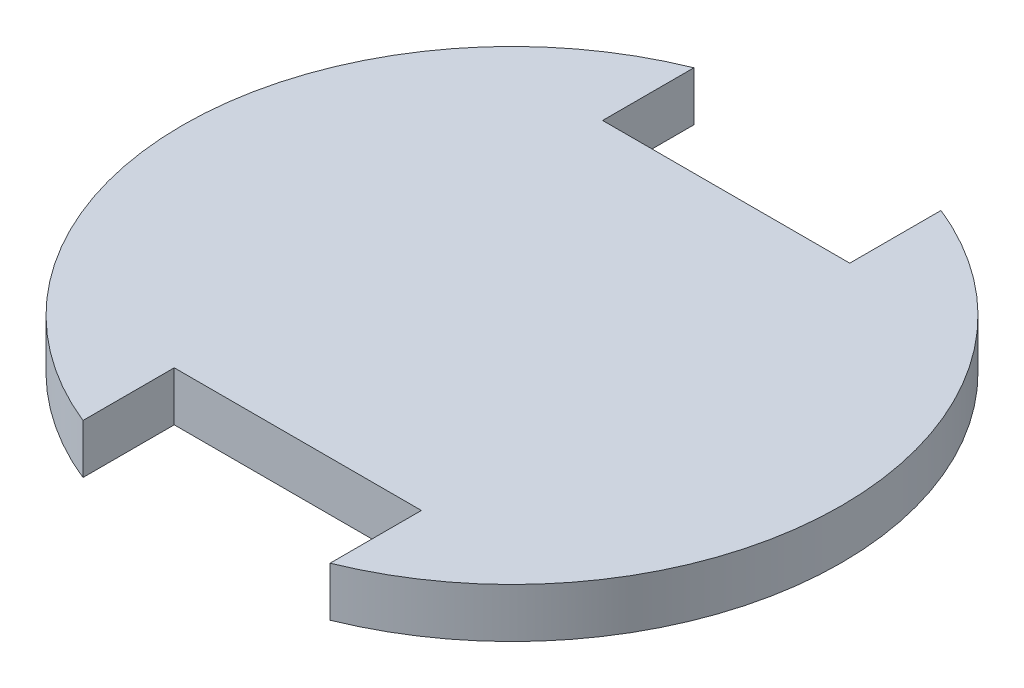
ISO-10303-21;
HEADER;
FILE_DESCRIPTION(('STEP AP214'),'2;1');
FILE_NAME('part.step','',(''),(''),'','','');
FILE_SCHEMA(('AUTOMOTIVE_DESIGN { 1 0 10303 214 1 1 1 1 }'));
ENDSEC;
DATA;
#1=APPLICATION_CONTEXT('core data for automotive mechanical design processes');
#2=APPLICATION_PROTOCOL_DEFINITION('international standard','automotive_design',2000,#1);
#3=PRODUCT_CONTEXT('',#1,'mechanical');
#4=PRODUCT('Part','Part','',(#3));
#5=PRODUCT_RELATED_PRODUCT_CATEGORY('part','',(#4));
#6=PRODUCT_DEFINITION_FORMATION('','',#4);
#7=PRODUCT_DEFINITION_CONTEXT('part definition',#1,'design');
#8=PRODUCT_DEFINITION('design','',#6,#7);
#9=PRODUCT_DEFINITION_SHAPE('','',#8);
#10=(LENGTH_UNIT() NAMED_UNIT(*) SI_UNIT(.MILLI.,.METRE.));
#11=(NAMED_UNIT(*) PLANE_ANGLE_UNIT() SI_UNIT($,.RADIAN.));
#12=(NAMED_UNIT(*) SI_UNIT($,.STERADIAN.) SOLID_ANGLE_UNIT());
#13=UNCERTAINTY_MEASURE_WITH_UNIT(LENGTH_MEASURE(1.E-05),#10,'distance_accuracy_value','');
#14=(GEOMETRIC_REPRESENTATION_CONTEXT(3) GLOBAL_UNCERTAINTY_ASSIGNED_CONTEXT((#13)) GLOBAL_UNIT_ASSIGNED_CONTEXT((#10,
#11,#12)) REPRESENTATION_CONTEXT('',''));
#15=CARTESIAN_POINT('',(0.,0.,0.));
#16=DIRECTION('',(0.,0.,1.));
#17=DIRECTION('',(1.,0.,0.));
#18=AXIS2_PLACEMENT_3D('',#15,#16,#17);
#19=CARTESIAN_POINT('',(0.,1.5,0.));
#20=DIRECTION('',(0.,-1.,0.));
#21=DIRECTION('',(0.,0.,-1.));
#22=AXIS2_PLACEMENT_3D('',#19,#20,#21);
#23=CYLINDRICAL_SURFACE('',#22,20.);
#24=DIRECTION('',(0.,-1.,0.));
#25=VECTOR('',#24,1.);
#26=CARTESIAN_POINT('',(7.5,1.5,18.5404962177392));
#27=LINE('',#26,#25);
#28=CARTESIAN_POINT('',(7.5,-1.5,18.5404962177392));
#29=VERTEX_POINT('',#28);
#30=CARTESIAN_POINT('',(7.5,1.5,18.5404962177392));
#31=VERTEX_POINT('',#30);
#32=EDGE_CURVE('E115',#29,#31,#27,.F.);
#33=ORIENTED_EDGE('',*,*,#32,.F.);
#34=CARTESIAN_POINT('',(0.,-1.5,0.));
#35=DIRECTION('',(0.,1.,0.));
#36=DIRECTION('',(0.,0.,1.));
#37=AXIS2_PLACEMENT_3D('',#34,#35,#36);
#38=CIRCLE('',#37,20.);
#39=CARTESIAN_POINT('',(7.5,-1.5,-18.5404962177392));
#40=VERTEX_POINT('',#39);
#41=EDGE_CURVE('E150',#29,#40,#38,.T.);
#42=ORIENTED_EDGE('',*,*,#41,.T.);
#43=DIRECTION('',(0.,-1.,0.));
#44=VECTOR('',#43,1.);
#45=CARTESIAN_POINT('',(7.5,1.5,-18.5404962177392));
#46=LINE('',#45,#44);
#47=CARTESIAN_POINT('',(7.5,1.5,-18.5404962177392));
#48=VERTEX_POINT('',#47);
#49=EDGE_CURVE('E144',#40,#48,#46,.F.);
#50=ORIENTED_EDGE('',*,*,#49,.T.);
#51=CARTESIAN_POINT('',(0.,1.5,0.));
#52=DIRECTION('',(0.,1.,0.));
#53=DIRECTION('',(0.,0.,1.));
#54=AXIS2_PLACEMENT_3D('',#51,#52,#53);
#55=CIRCLE('',#54,20.);
#56=EDGE_CURVE('E153',#31,#48,#55,.T.);
#57=ORIENTED_EDGE('',*,*,#56,.F.);
#58=EDGE_LOOP('',(#33,#42,#50,#57));
#59=FACE_BOUND('',#58,.T.);
#60=ADVANCED_FACE('F35',(#59),#23,.T.);
#61=DIRECTION('',(0.,-1.,0.));
#62=VECTOR('',#61,1.);
#63=CARTESIAN_POINT('',(-7.5,1.5,18.5404962177392));
#64=LINE('',#63,#62);
#65=CARTESIAN_POINT('',(-7.5,1.5,18.5404962177392));
#66=VERTEX_POINT('',#65);
#67=CARTESIAN_POINT('',(-7.5,-1.5,18.5404962177392));
#68=VERTEX_POINT('',#67);
#69=EDGE_CURVE('E49',#66,#68,#64,.T.);
#70=ORIENTED_EDGE('',*,*,#69,.F.);
#71=CARTESIAN_POINT('',(-7.5,1.5,-18.5404962177392));
#72=VERTEX_POINT('',#71);
#73=EDGE_CURVE('E151',#72,#66,#55,.T.);
#74=ORIENTED_EDGE('',*,*,#73,.F.);
#75=DIRECTION('',(0.,-1.,0.));
#76=VECTOR('',#75,1.);
#77=CARTESIAN_POINT('',(-7.5,1.5,-18.5404962177392));
#78=LINE('',#77,#76);
#79=CARTESIAN_POINT('',(-7.5,-1.5,-18.5404962177392));
#80=VERTEX_POINT('',#79);
#81=EDGE_CURVE('E147',#72,#80,#78,.T.);
#82=ORIENTED_EDGE('',*,*,#81,.T.);
#83=EDGE_CURVE('E154',#80,#68,#38,.T.);
#84=ORIENTED_EDGE('',*,*,#83,.T.);
#85=EDGE_LOOP('',(#70,#74,#82,#84));
#86=FACE_BOUND('',#85,.T.);
#87=ADVANCED_FACE('F176',(#86),#23,.T.);
#88=CARTESIAN_POINT('',(0.,1.5,0.));
#89=DIRECTION('',(0.,1.,0.));
#90=DIRECTION('',(0.,0.,1.));
#91=AXIS2_PLACEMENT_3D('',#88,#89,#90);
#92=PLANE('',#91);
#93=DIRECTION('',(1.,0.,0.));
#94=VECTOR('',#93,1.);
#95=CARTESIAN_POINT('',(-7.49999999999999,1.5,13.));
#96=LINE('',#95,#94);
#97=CARTESIAN_POINT('',(-7.49999999999999,1.5,13.));
#98=VERTEX_POINT('',#97);
#99=CARTESIAN_POINT('',(7.5,1.5,13.));
#100=VERTEX_POINT('',#99);
#101=EDGE_CURVE('E103',#98,#100,#96,.T.);
#102=ORIENTED_EDGE('',*,*,#101,.T.);
#103=DIRECTION('',(0.,0.,1.));
#104=VECTOR('',#103,1.);
#105=CARTESIAN_POINT('',(7.49999999999999,1.5,23.));
#106=LINE('',#105,#104);
#107=EDGE_CURVE('E112',#100,#31,#106,.T.);
#108=ORIENTED_EDGE('',*,*,#107,.T.);
#109=ORIENTED_EDGE('',*,*,#56,.T.);
#110=DIRECTION('',(0.,0.,-1.));
#111=VECTOR('',#110,1.);
#112=CARTESIAN_POINT('',(7.49999999999999,1.5,-23.));
#113=LINE('',#112,#111);
#114=CARTESIAN_POINT('',(7.5,1.5,-13.));
#115=VERTEX_POINT('',#114);
#116=EDGE_CURVE('E136',#115,#48,#113,.T.);
#117=ORIENTED_EDGE('',*,*,#116,.F.);
#118=DIRECTION('',(1.,0.,0.));
#119=VECTOR('',#118,1.);
#120=CARTESIAN_POINT('',(-7.49999999999999,1.5,-13.));
#121=LINE('',#120,#119);
#122=CARTESIAN_POINT('',(-7.49999999999999,1.5,-13.));
#123=VERTEX_POINT('',#122);
#124=EDGE_CURVE('E134',#123,#115,#121,.T.);
#125=ORIENTED_EDGE('',*,*,#124,.F.);
#126=DIRECTION('',(0.,0.,1.));
#127=VECTOR('',#126,1.);
#128=CARTESIAN_POINT('',(-7.50000000000001,1.5,-23.));
#129=LINE('',#128,#127);
#130=EDGE_CURVE('E129',#72,#123,#129,.T.);
#131=ORIENTED_EDGE('',*,*,#130,.F.);
#132=ORIENTED_EDGE('',*,*,#73,.T.);
#133=DIRECTION('',(0.,0.,-1.));
#134=VECTOR('',#133,1.);
#135=CARTESIAN_POINT('',(-7.50000000000001,1.5,23.));
#136=LINE('',#135,#134);
#137=EDGE_CURVE('E118',#66,#98,#136,.T.);
#138=ORIENTED_EDGE('',*,*,#137,.T.);
#139=EDGE_LOOP('',(#102,#108,#109,#117,#125,#131,#132,#138));
#140=FACE_BOUND('',#139,.T.);
#141=ADVANCED_FACE('F120',(#140),#92,.T.);
#142=CARTESIAN_POINT('',(0.,-1.5,0.));
#143=DIRECTION('',(0.,1.,0.));
#144=DIRECTION('',(0.,0.,1.));
#145=AXIS2_PLACEMENT_3D('',#142,#143,#144);
#146=PLANE('',#145);
#147=DIRECTION('',(0.,0.,1.));
#148=VECTOR('',#147,1.);
#149=CARTESIAN_POINT('',(7.5,-1.5,0.));
#150=LINE('',#149,#148);
#151=CARTESIAN_POINT('',(7.5,-1.5,13.));
#152=VERTEX_POINT('',#151);
#153=EDGE_CURVE('E11',#152,#29,#150,.T.);
#154=ORIENTED_EDGE('',*,*,#153,.F.);
#155=DIRECTION('',(-1.,0.,0.));
#156=VECTOR('',#155,1.);
#157=CARTESIAN_POINT('',(-7.49999999999999,-1.5,13.));
#158=LINE('',#157,#156);
#159=CARTESIAN_POINT('',(-7.49999999999999,-1.5,13.));
#160=VERTEX_POINT('',#159);
#161=EDGE_CURVE('E106',#152,#160,#158,.T.);
#162=ORIENTED_EDGE('',*,*,#161,.T.);
#163=DIRECTION('',(0.,0.,1.));
#164=VECTOR('',#163,1.);
#165=CARTESIAN_POINT('',(-7.50000000000001,-1.5,23.));
#166=LINE('',#165,#164);
#167=EDGE_CURVE('E127',#160,#68,#166,.T.);
#168=ORIENTED_EDGE('',*,*,#167,.T.);
#169=ORIENTED_EDGE('',*,*,#83,.F.);
#170=DIRECTION('',(0.,0.,-1.));
#171=VECTOR('',#170,1.);
#172=CARTESIAN_POINT('',(-7.50000000000001,-1.5,-23.));
#173=LINE('',#172,#171);
#174=CARTESIAN_POINT('',(-7.49999999999999,-1.5,-13.));
#175=VERTEX_POINT('',#174);
#176=EDGE_CURVE('E130',#175,#80,#173,.T.);
#177=ORIENTED_EDGE('',*,*,#176,.F.);
#178=DIRECTION('',(-1.,0.,0.));
#179=VECTOR('',#178,1.);
#180=CARTESIAN_POINT('',(-7.49999999999999,-1.5,-13.));
#181=LINE('',#180,#179);
#182=CARTESIAN_POINT('',(7.5,-1.5,-13.));
#183=VERTEX_POINT('',#182);
#184=EDGE_CURVE('E132',#183,#175,#181,.T.);
#185=ORIENTED_EDGE('',*,*,#184,.F.);
#186=DIRECTION('',(0.,0.,-1.));
#187=VECTOR('',#186,1.);
#188=CARTESIAN_POINT('',(7.5,-1.5,0.));
#189=LINE('',#188,#187);
#190=EDGE_CURVE('E42',#183,#40,#189,.T.);
#191=ORIENTED_EDGE('',*,*,#190,.T.);
#192=ORIENTED_EDGE('',*,*,#41,.F.);
#193=EDGE_LOOP('',(#154,#162,#168,#169,#177,#185,#191,#192));
#194=FACE_BOUND('',#193,.T.);
#195=ADVANCED_FACE('F160',(#194),#146,.F.);
#196=CARTESIAN_POINT('',(-7.50000000000001,-19.5277563773199,-23.));
#197=DIRECTION('',(-1.,0.,0.));
#198=DIRECTION('',(0.,0.,1.));
#199=AXIS2_PLACEMENT_3D('',#196,#197,#198);
#200=PLANE('',#199);
#201=ORIENTED_EDGE('',*,*,#130,.T.);
#202=DIRECTION('',(0.,1.,0.));
#203=VECTOR('',#202,1.);
#204=CARTESIAN_POINT('',(-7.49999999999999,-19.5277563773199,-13.));
#205=LINE('',#204,#203);
#206=EDGE_CURVE('E139',#175,#123,#205,.T.);
#207=ORIENTED_EDGE('',*,*,#206,.F.);
#208=ORIENTED_EDGE('',*,*,#176,.T.);
#209=ORIENTED_EDGE('',*,*,#81,.F.);
#210=EDGE_LOOP('',(#201,#207,#208,#209));
#211=FACE_BOUND('',#210,.T.);
#212=ADVANCED_FACE('F173',(#211),#200,.F.);
#213=CARTESIAN_POINT('',(7.49999999999999,-19.5277563773199,-23.));
#214=DIRECTION('',(1.,0.,0.));
#215=DIRECTION('',(0.,0.,-1.));
#216=AXIS2_PLACEMENT_3D('',#213,#214,#215);
#217=PLANE('',#216);
#218=ORIENTED_EDGE('',*,*,#190,.F.);
#219=DIRECTION('',(0.,1.,0.));
#220=VECTOR('',#219,1.);
#221=CARTESIAN_POINT('',(7.5,-19.5277563773199,-13.));
#222=LINE('',#221,#220);
#223=EDGE_CURVE('E57',#183,#115,#222,.T.);
#224=ORIENTED_EDGE('',*,*,#223,.T.);
#225=ORIENTED_EDGE('',*,*,#116,.T.);
#226=ORIENTED_EDGE('',*,*,#49,.F.);
#227=EDGE_LOOP('',(#218,#224,#225,#226));
#228=FACE_BOUND('',#227,.T.);
#229=ADVANCED_FACE('F164',(#228),#217,.F.);
#230=CARTESIAN_POINT('',(-7.49999999999999,-19.5277563773199,-13.));
#231=DIRECTION('',(0.,0.,1.));
#232=DIRECTION('',(1.,0.,0.));
#233=AXIS2_PLACEMENT_3D('',#230,#231,#232);
#234=PLANE('',#233);
#235=ORIENTED_EDGE('',*,*,#184,.T.);
#236=ORIENTED_EDGE('',*,*,#206,.T.);
#237=ORIENTED_EDGE('',*,*,#124,.T.);
#238=ORIENTED_EDGE('',*,*,#223,.F.);
#239=EDGE_LOOP('',(#235,#236,#237,#238));
#240=FACE_BOUND('',#239,.T.);
#241=ADVANCED_FACE('F170',(#240),#234,.F.);
#242=CARTESIAN_POINT('',(7.49999999999999,-19.5277563773199,23.));
#243=DIRECTION('',(-1.,0.,0.));
#244=DIRECTION('',(0.,0.,1.));
#245=AXIS2_PLACEMENT_3D('',#242,#243,#244);
#246=PLANE('',#245);
#247=ORIENTED_EDGE('',*,*,#32,.T.);
#248=ORIENTED_EDGE('',*,*,#107,.F.);
#249=DIRECTION('',(0.,1.,0.));
#250=VECTOR('',#249,1.);
#251=CARTESIAN_POINT('',(7.5,-19.5277563773199,13.));
#252=LINE('',#251,#250);
#253=EDGE_CURVE('E98',#152,#100,#252,.T.);
#254=ORIENTED_EDGE('',*,*,#253,.F.);
#255=ORIENTED_EDGE('',*,*,#153,.T.);
#256=EDGE_LOOP('',(#247,#248,#254,#255));
#257=FACE_BOUND('',#256,.T.);
#258=ADVANCED_FACE('F113',(#257),#246,.T.);
#259=CARTESIAN_POINT('',(-7.50000000000001,-19.5277563773199,23.));
#260=DIRECTION('',(1.,0.,0.));
#261=DIRECTION('',(0.,0.,-1.));
#262=AXIS2_PLACEMENT_3D('',#259,#260,#261);
#263=PLANE('',#262);
#264=ORIENTED_EDGE('',*,*,#69,.T.);
#265=ORIENTED_EDGE('',*,*,#167,.F.);
#266=DIRECTION('',(0.,1.,0.));
#267=VECTOR('',#266,1.);
#268=CARTESIAN_POINT('',(-7.49999999999999,-19.5277563773199,13.));
#269=LINE('',#268,#267);
#270=EDGE_CURVE('E109',#160,#98,#269,.T.);
#271=ORIENTED_EDGE('',*,*,#270,.T.);
#272=ORIENTED_EDGE('',*,*,#137,.F.);
#273=EDGE_LOOP('',(#264,#265,#271,#272));
#274=FACE_BOUND('',#273,.T.);
#275=ADVANCED_FACE('F217',(#274),#263,.T.);
#276=CARTESIAN_POINT('',(-7.49999999999999,-19.5277563773199,13.));
#277=DIRECTION('',(0.,0.,1.));
#278=DIRECTION('',(1.,0.,0.));
#279=AXIS2_PLACEMENT_3D('',#276,#277,#278);
#280=PLANE('',#279);
#281=ORIENTED_EDGE('',*,*,#253,.T.);
#282=ORIENTED_EDGE('',*,*,#101,.F.);
#283=ORIENTED_EDGE('',*,*,#270,.F.);
#284=ORIENTED_EDGE('',*,*,#161,.F.);
#285=EDGE_LOOP('',(#281,#282,#283,#284));
#286=FACE_BOUND('',#285,.T.);
#287=ADVANCED_FACE('F100',(#286),#280,.T.);
#288=CLOSED_SHELL('',(#60,#87,#141,#195,#212,#229,#241,#258,#275,#287));
#289=MANIFOLD_SOLID_BREP('B2',#288);
#290=ADVANCED_BREP_SHAPE_REPRESENTATION('',(#18,#289),#14);
#291=SHAPE_DEFINITION_REPRESENTATION(#9,#290);
ENDSEC;
END-ISO-10303-21;
